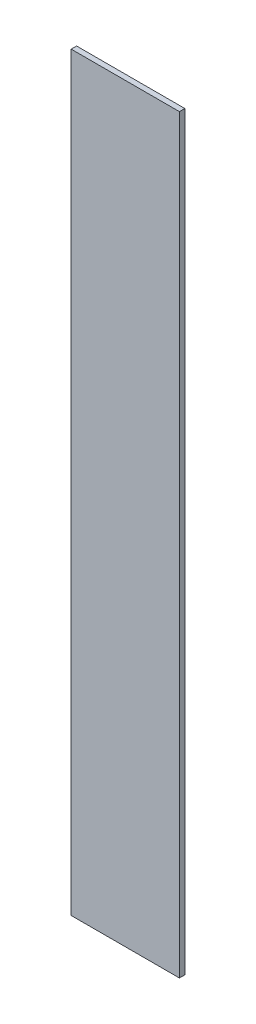
ISO-10303-21;
HEADER;
FILE_DESCRIPTION(('STEP AP214'),'2;1');
FILE_NAME('part.step','',(''),(''),'','','');
FILE_SCHEMA(('AUTOMOTIVE_DESIGN { 1 0 10303 214 1 1 1 1 }'));
ENDSEC;
DATA;
#1=APPLICATION_CONTEXT('core data for automotive mechanical design processes');
#2=APPLICATION_PROTOCOL_DEFINITION('international standard','automotive_design',2000,#1);
#3=PRODUCT_CONTEXT('',#1,'mechanical');
#4=PRODUCT('Part','Part','',(#3));
#5=PRODUCT_RELATED_PRODUCT_CATEGORY('part','',(#4));
#6=PRODUCT_DEFINITION_FORMATION('','',#4);
#7=PRODUCT_DEFINITION_CONTEXT('part definition',#1,'design');
#8=PRODUCT_DEFINITION('design','',#6,#7);
#9=PRODUCT_DEFINITION_SHAPE('','',#8);
#10=(LENGTH_UNIT() NAMED_UNIT(*) SI_UNIT(.MILLI.,.METRE.));
#11=(NAMED_UNIT(*) PLANE_ANGLE_UNIT() SI_UNIT($,.RADIAN.));
#12=(NAMED_UNIT(*) SI_UNIT($,.STERADIAN.) SOLID_ANGLE_UNIT());
#13=UNCERTAINTY_MEASURE_WITH_UNIT(LENGTH_MEASURE(1.E-05),#10,'distance_accuracy_value','');
#14=(GEOMETRIC_REPRESENTATION_CONTEXT(3) GLOBAL_UNCERTAINTY_ASSIGNED_CONTEXT((#13)) GLOBAL_UNIT_ASSIGNED_CONTEXT((#10,
#11,#12)) REPRESENTATION_CONTEXT('',''));
#15=CARTESIAN_POINT('',(0.,0.,0.));
#16=DIRECTION('',(0.,0.,1.));
#17=DIRECTION('',(1.,0.,0.));
#18=AXIS2_PLACEMENT_3D('',#15,#16,#17);
#19=CARTESIAN_POINT('',(60.,-416.,6.));
#20=DIRECTION('',(-1.,0.,0.));
#21=DIRECTION('',(0.,0.,1.));
#22=AXIS2_PLACEMENT_3D('',#19,#20,#21);
#23=PLANE('',#22);
#24=DIRECTION('',(0.,1.,0.));
#25=VECTOR('',#24,1.);
#26=CARTESIAN_POINT('',(60.,-416.,0.));
#27=LINE('',#26,#25);
#28=CARTESIAN_POINT('',(60.,-416.,0.));
#29=VERTEX_POINT('',#28);
#30=CARTESIAN_POINT('',(60.,416.,0.));
#31=VERTEX_POINT('',#30);
#32=EDGE_CURVE('E95',#29,#31,#27,.T.);
#33=ORIENTED_EDGE('',*,*,#32,.T.);
#34=DIRECTION('',(0.,0.,-1.));
#35=VECTOR('',#34,1.);
#36=CARTESIAN_POINT('',(60.,416.,6.));
#37=LINE('',#36,#35);
#38=CARTESIAN_POINT('',(60.,416.,6.));
#39=VERTEX_POINT('',#38);
#40=EDGE_CURVE('E11',#39,#31,#37,.T.);
#41=ORIENTED_EDGE('',*,*,#40,.F.);
#42=DIRECTION('',(0.,1.,0.));
#43=VECTOR('',#42,1.);
#44=CARTESIAN_POINT('',(60.,-416.,6.));
#45=LINE('',#44,#43);
#46=CARTESIAN_POINT('',(60.,-416.,6.));
#47=VERTEX_POINT('',#46);
#48=EDGE_CURVE('E83',#47,#39,#45,.T.);
#49=ORIENTED_EDGE('',*,*,#48,.F.);
#50=DIRECTION('',(0.,0.,-1.));
#51=VECTOR('',#50,1.);
#52=CARTESIAN_POINT('',(60.,-416.,6.));
#53=LINE('',#52,#51);
#54=EDGE_CURVE('E91',#47,#29,#53,.T.);
#55=ORIENTED_EDGE('',*,*,#54,.T.);
#56=EDGE_LOOP('',(#33,#41,#49,#55));
#57=FACE_BOUND('',#56,.T.);
#58=ADVANCED_FACE('F32',(#57),#23,.F.);
#59=CARTESIAN_POINT('',(-60.,416.,6.));
#60=DIRECTION('',(0.,-1.,0.));
#61=DIRECTION('',(0.,0.,-1.));
#62=AXIS2_PLACEMENT_3D('',#59,#60,#61);
#63=PLANE('',#62);
#64=DIRECTION('',(-1.,0.,0.));
#65=VECTOR('',#64,1.);
#66=CARTESIAN_POINT('',(-60.,416.,0.));
#67=LINE('',#66,#65);
#68=CARTESIAN_POINT('',(-60.,416.,0.));
#69=VERTEX_POINT('',#68);
#70=EDGE_CURVE('E87',#31,#69,#67,.T.);
#71=ORIENTED_EDGE('',*,*,#70,.T.);
#72=DIRECTION('',(0.,0.,-1.));
#73=VECTOR('',#72,1.);
#74=CARTESIAN_POINT('',(-60.,416.,6.));
#75=LINE('',#74,#73);
#76=CARTESIAN_POINT('',(-60.,416.,6.));
#77=VERTEX_POINT('',#76);
#78=EDGE_CURVE('E40',#77,#69,#75,.T.);
#79=ORIENTED_EDGE('',*,*,#78,.F.);
#80=DIRECTION('',(-1.,0.,0.));
#81=VECTOR('',#80,1.);
#82=CARTESIAN_POINT('',(-60.,416.,6.));
#83=LINE('',#82,#81);
#84=EDGE_CURVE('E78',#39,#77,#83,.T.);
#85=ORIENTED_EDGE('',*,*,#84,.F.);
#86=ORIENTED_EDGE('',*,*,#40,.T.);
#87=EDGE_LOOP('',(#71,#79,#85,#86));
#88=FACE_BOUND('',#87,.T.);
#89=ADVANCED_FACE('F86',(#88),#63,.F.);
#90=CARTESIAN_POINT('',(-60.,-416.,6.));
#91=DIRECTION('',(1.,0.,0.));
#92=DIRECTION('',(0.,0.,-1.));
#93=AXIS2_PLACEMENT_3D('',#90,#91,#92);
#94=PLANE('',#93);
#95=DIRECTION('',(0.,-1.,0.));
#96=VECTOR('',#95,1.);
#97=CARTESIAN_POINT('',(-60.,-416.,0.));
#98=LINE('',#97,#96);
#99=CARTESIAN_POINT('',(-60.,-416.,0.));
#100=VERTEX_POINT('',#99);
#101=EDGE_CURVE('E65',#69,#100,#98,.T.);
#102=ORIENTED_EDGE('',*,*,#101,.T.);
#103=DIRECTION('',(0.,0.,-1.));
#104=VECTOR('',#103,1.);
#105=CARTESIAN_POINT('',(-60.,-416.,6.));
#106=LINE('',#105,#104);
#107=CARTESIAN_POINT('',(-60.,-416.,6.));
#108=VERTEX_POINT('',#107);
#109=EDGE_CURVE('E88',#108,#100,#106,.T.);
#110=ORIENTED_EDGE('',*,*,#109,.F.);
#111=DIRECTION('',(0.,-1.,0.));
#112=VECTOR('',#111,1.);
#113=CARTESIAN_POINT('',(-60.,-416.,6.));
#114=LINE('',#113,#112);
#115=EDGE_CURVE('E81',#77,#108,#114,.T.);
#116=ORIENTED_EDGE('',*,*,#115,.F.);
#117=ORIENTED_EDGE('',*,*,#78,.T.);
#118=EDGE_LOOP('',(#102,#110,#116,#117));
#119=FACE_BOUND('',#118,.T.);
#120=ADVANCED_FACE('F89',(#119),#94,.F.);
#121=CARTESIAN_POINT('',(-60.,-416.,6.));
#122=DIRECTION('',(0.,1.,0.));
#123=DIRECTION('',(0.,0.,1.));
#124=AXIS2_PLACEMENT_3D('',#121,#122,#123);
#125=PLANE('',#124);
#126=DIRECTION('',(1.,0.,0.));
#127=VECTOR('',#126,1.);
#128=CARTESIAN_POINT('',(-60.,-416.,0.));
#129=LINE('',#128,#127);
#130=EDGE_CURVE('E71',#100,#29,#129,.T.);
#131=ORIENTED_EDGE('',*,*,#130,.T.);
#132=ORIENTED_EDGE('',*,*,#54,.F.);
#133=DIRECTION('',(1.,0.,0.));
#134=VECTOR('',#133,1.);
#135=CARTESIAN_POINT('',(-60.,-416.,6.));
#136=LINE('',#135,#134);
#137=EDGE_CURVE('E48',#108,#47,#136,.T.);
#138=ORIENTED_EDGE('',*,*,#137,.F.);
#139=ORIENTED_EDGE('',*,*,#109,.T.);
#140=EDGE_LOOP('',(#131,#132,#138,#139));
#141=FACE_BOUND('',#140,.T.);
#142=ADVANCED_FACE('F102',(#141),#125,.F.);
#143=CARTESIAN_POINT('',(0.,0.,6.));
#144=DIRECTION('',(0.,0.,-1.));
#145=DIRECTION('',(-1.,0.,0.));
#146=AXIS2_PLACEMENT_3D('',#143,#144,#145);
#147=PLANE('',#146);
#148=ORIENTED_EDGE('',*,*,#48,.T.);
#149=ORIENTED_EDGE('',*,*,#84,.T.);
#150=ORIENTED_EDGE('',*,*,#115,.T.);
#151=ORIENTED_EDGE('',*,*,#137,.T.);
#152=EDGE_LOOP('',(#148,#149,#150,#151));
#153=FACE_BOUND('',#152,.T.);
#154=ADVANCED_FACE('F79',(#153),#147,.F.);
#155=CARTESIAN_POINT('',(0.,0.,0.));
#156=DIRECTION('',(0.,0.,-1.));
#157=DIRECTION('',(-1.,0.,0.));
#158=AXIS2_PLACEMENT_3D('',#155,#156,#157);
#159=PLANE('',#158);
#160=ORIENTED_EDGE('',*,*,#32,.F.);
#161=ORIENTED_EDGE('',*,*,#130,.F.);
#162=ORIENTED_EDGE('',*,*,#101,.F.);
#163=ORIENTED_EDGE('',*,*,#70,.F.);
#164=EDGE_LOOP('',(#160,#161,#162,#163));
#165=FACE_BOUND('',#164,.T.);
#166=ADVANCED_FACE('F105',(#165),#159,.T.);
#167=CLOSED_SHELL('',(#58,#89,#120,#142,#154,#166));
#168=MANIFOLD_SOLID_BREP('B2',#167);
#169=ADVANCED_BREP_SHAPE_REPRESENTATION('',(#18,#168),#14);
#170=SHAPE_DEFINITION_REPRESENTATION(#9,#169);
ENDSEC;
END-ISO-10303-21;
